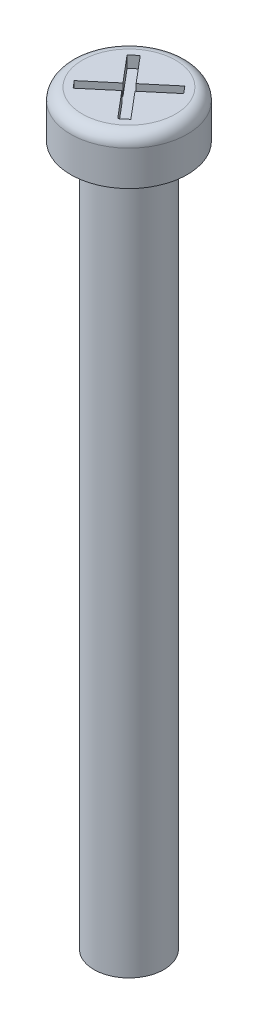
ISO-10303-21;
HEADER;
FILE_DESCRIPTION(('STEP AP214'),'2;1');
FILE_NAME('part.step','',(''),(''),'','','');
FILE_SCHEMA(('AUTOMOTIVE_DESIGN { 1 0 10303 214 1 1 1 1 }'));
ENDSEC;
DATA;
#1=APPLICATION_CONTEXT('core data for automotive mechanical design processes');
#2=APPLICATION_PROTOCOL_DEFINITION('international standard','automotive_design',2000,#1);
#3=PRODUCT_CONTEXT('',#1,'mechanical');
#4=PRODUCT('Part','Part','',(#3));
#5=PRODUCT_RELATED_PRODUCT_CATEGORY('part','',(#4));
#6=PRODUCT_DEFINITION_FORMATION('','',#4);
#7=PRODUCT_DEFINITION_CONTEXT('part definition',#1,'design');
#8=PRODUCT_DEFINITION('design','',#6,#7);
#9=PRODUCT_DEFINITION_SHAPE('','',#8);
#10=(LENGTH_UNIT() NAMED_UNIT(*) SI_UNIT(.MILLI.,.METRE.));
#11=(NAMED_UNIT(*) PLANE_ANGLE_UNIT() SI_UNIT($,.RADIAN.));
#12=(NAMED_UNIT(*) SI_UNIT($,.STERADIAN.) SOLID_ANGLE_UNIT());
#13=UNCERTAINTY_MEASURE_WITH_UNIT(LENGTH_MEASURE(1.E-05),#10,'distance_accuracy_value','');
#14=(GEOMETRIC_REPRESENTATION_CONTEXT(3) GLOBAL_UNCERTAINTY_ASSIGNED_CONTEXT((#13)) GLOBAL_UNIT_ASSIGNED_CONTEXT((#10,
#11,#12)) REPRESENTATION_CONTEXT('',''));
#15=CARTESIAN_POINT('',(0.,0.,0.));
#16=DIRECTION('',(0.,0.,1.));
#17=DIRECTION('',(1.,0.,0.));
#18=AXIS2_PLACEMENT_3D('',#15,#16,#17);
#19=CARTESIAN_POINT('',(0.,32.,0.));
#20=DIRECTION('',(0.,-1.,0.));
#21=DIRECTION('',(1.,0.,0.));
#22=AXIS2_PLACEMENT_3D('',#19,#20,#21);
#23=PLANE('',#22);
#24=DIRECTION('',(0.644699512907657,0.,0.764436091545022));
#25=VECTOR('',#24,1.);
#26=CARTESIAN_POINT('',(-1.23673160122054,32.,-1.15620107756156));
#27=LINE('',#26,#25);
#28=CARTESIAN_POINT('',(-1.23673160122054,32.,-1.15620107756156));
#29=VERTEX_POINT('',#28);
#30=CARTESIAN_POINT('',(-0.281827120890536,32.,-0.0239473157274735));
#31=VERTEX_POINT('',#30);
#32=EDGE_CURVE('E157',#29,#31,#27,.T.);
#33=ORIENTED_EDGE('',*,*,#32,.F.);
#34=DIRECTION('',(-0.764436091545022,0.,0.644699512907657));
#35=VECTOR('',#34,1.);
#36=CARTESIAN_POINT('',(-1.23673160122054,32.,-1.15620107756156));
#37=LINE('',#36,#35);
#38=CARTESIAN_POINT('',(-0.930957164602532,32.,-1.41408088272463));
#39=VERTEX_POINT('',#38);
#40=EDGE_CURVE('E47',#39,#29,#37,.T.);
#41=ORIENTED_EDGE('',*,*,#40,.F.);
#42=DIRECTION('',(-0.644699512907657,0.,-0.764436091545023));
#43=VECTOR('',#42,1.);
#44=CARTESIAN_POINT('',(-0.930957164602532,32.,-1.41408088272463));
#45=LINE('',#44,#43);
#46=CARTESIAN_POINT('',(0.023947315727473,32.,-0.281827120890536));
#47=VERTEX_POINT('',#46);
#48=EDGE_CURVE('E184',#47,#39,#45,.T.);
#49=ORIENTED_EDGE('',*,*,#48,.F.);
#50=DIRECTION('',(-0.764436091545023,0.,0.644699512907656));
#51=VECTOR('',#50,1.);
#52=CARTESIAN_POINT('',(0.023947315727473,32.,-0.281827120890536));
#53=LINE('',#52,#51);
#54=CARTESIAN_POINT('',(1.15620107756156,32.,-1.23673160122054));
#55=VERTEX_POINT('',#54);
#56=EDGE_CURVE('E182',#55,#47,#53,.T.);
#57=ORIENTED_EDGE('',*,*,#56,.F.);
#58=DIRECTION('',(-0.644699512907656,0.,-0.764436091545023));
#59=VECTOR('',#58,1.);
#60=CARTESIAN_POINT('',(1.41408088272463,32.,-0.930957164602532));
#61=LINE('',#60,#59);
#62=CARTESIAN_POINT('',(1.41408088272463,32.,-0.930957164602532));
#63=VERTEX_POINT('',#62);
#64=EDGE_CURVE('E131',#63,#55,#61,.T.);
#65=ORIENTED_EDGE('',*,*,#64,.F.);
#66=DIRECTION('',(0.764436091545023,0.,-0.644699512907656));
#67=VECTOR('',#66,1.);
#68=CARTESIAN_POINT('',(0.281827120890536,32.,0.0239473157274728));
#69=LINE('',#68,#67);
#70=CARTESIAN_POINT('',(0.281827120890536,32.,0.0239473157274728));
#71=VERTEX_POINT('',#70);
#72=EDGE_CURVE('E178',#71,#63,#69,.T.);
#73=ORIENTED_EDGE('',*,*,#72,.F.);
#74=DIRECTION('',(-0.644699512907657,0.,-0.764436091545023));
#75=VECTOR('',#74,1.);
#76=CARTESIAN_POINT('',(0.281827120890536,32.,0.0239473157274728));
#77=LINE('',#76,#75);
#78=CARTESIAN_POINT('',(1.23673160122054,32.,1.15620107756156));
#79=VERTEX_POINT('',#78);
#80=EDGE_CURVE('E175',#79,#71,#77,.T.);
#81=ORIENTED_EDGE('',*,*,#80,.F.);
#82=DIRECTION('',(0.764436091545022,0.,-0.644699512907657));
#83=VECTOR('',#82,1.);
#84=CARTESIAN_POINT('',(0.930957164602532,32.,1.41408088272463));
#85=LINE('',#84,#83);
#86=CARTESIAN_POINT('',(0.930957164602532,32.,1.41408088272463));
#87=VERTEX_POINT('',#86);
#88=EDGE_CURVE('E172',#87,#79,#85,.T.);
#89=ORIENTED_EDGE('',*,*,#88,.F.);
#90=DIRECTION('',(0.644699512907657,0.,0.764436091545023));
#91=VECTOR('',#90,1.);
#92=CARTESIAN_POINT('',(-0.0239473157274736,32.,0.281827120890536));
#93=LINE('',#92,#91);
#94=CARTESIAN_POINT('',(-0.0239473157274736,32.,0.281827120890536));
#95=VERTEX_POINT('',#94);
#96=EDGE_CURVE('E169',#95,#87,#93,.T.);
#97=ORIENTED_EDGE('',*,*,#96,.F.);
#98=DIRECTION('',(0.764436091545023,0.,-0.644699512907656));
#99=VECTOR('',#98,1.);
#100=CARTESIAN_POINT('',(-1.15620107756156,32.,1.23673160122054));
#101=LINE('',#100,#99);
#102=CARTESIAN_POINT('',(-1.15620107756156,32.,1.23673160122054));
#103=VERTEX_POINT('',#102);
#104=EDGE_CURVE('E166',#103,#95,#101,.T.);
#105=ORIENTED_EDGE('',*,*,#104,.F.);
#106=DIRECTION('',(0.644699512907656,0.,0.764436091545023));
#107=VECTOR('',#106,1.);
#108=CARTESIAN_POINT('',(-1.15620107756156,32.,1.23673160122054));
#109=LINE('',#108,#107);
#110=CARTESIAN_POINT('',(-1.41408088272463,32.,0.930957164602532));
#111=VERTEX_POINT('',#110);
#112=EDGE_CURVE('E163',#111,#103,#109,.T.);
#113=ORIENTED_EDGE('',*,*,#112,.F.);
#114=DIRECTION('',(-0.764436091545023,0.,0.644699512907656));
#115=VECTOR('',#114,1.);
#116=CARTESIAN_POINT('',(-1.41408088272463,32.,0.930957164602532));
#117=LINE('',#116,#115);
#118=EDGE_CURVE('E160',#31,#111,#117,.T.);
#119=ORIENTED_EDGE('',*,*,#118,.F.);
#120=EDGE_LOOP('',(#33,#41,#49,#57,#65,#73,#81,#89,#97,#105,#113,#119));
#121=FACE_BOUND('',#120,.T.);
#122=CARTESIAN_POINT('',(0.,32.,0.));
#123=DIRECTION('',(0.,1.,0.));
#124=DIRECTION('',(-1.,0.,0.));
#125=AXIS2_PLACEMENT_3D('',#122,#123,#124);
#126=CIRCLE('',#125,2.);
#127=CARTESIAN_POINT('',(-2.,32.,0.));
#128=VERTEX_POINT('',#127);
#129=EDGE_CURVE('E11',#128,#128,#126,.T.);
#130=ORIENTED_EDGE('',*,*,#129,.T.);
#131=EDGE_LOOP('',(#130));
#132=FACE_BOUND('',#131,.T.);
#133=ADVANCED_FACE('F33',(#121,#132),#23,.F.);
#134=CARTESIAN_POINT('',(0.,31.5,0.));
#135=DIRECTION('',(0.,1.,0.));
#136=DIRECTION('',(-1.,0.,0.));
#137=AXIS2_PLACEMENT_3D('',#134,#135,#136);
#138=TOROIDAL_SURFACE('',#137,2.,0.5);
#139=ORIENTED_EDGE('',*,*,#129,.F.);
#140=EDGE_LOOP('',(#139));
#141=FACE_BOUND('',#140,.T.);
#142=CARTESIAN_POINT('',(0.,31.5,0.));
#143=DIRECTION('',(0.,1.,0.));
#144=DIRECTION('',(-1.,0.,0.));
#145=AXIS2_PLACEMENT_3D('',#142,#143,#144);
#146=CIRCLE('',#145,2.5);
#147=CARTESIAN_POINT('',(-2.5,31.5,0.));
#148=VERTEX_POINT('',#147);
#149=EDGE_CURVE('E40',#148,#148,#146,.T.);
#150=ORIENTED_EDGE('',*,*,#149,.T.);
#151=EDGE_LOOP('',(#150));
#152=FACE_BOUND('',#151,.T.);
#153=ADVANCED_FACE('F216',(#141,#152),#138,.T.);
#154=CARTESIAN_POINT('',(0.,32.,0.));
#155=DIRECTION('',(0.,1.,0.));
#156=DIRECTION('',(-1.,0.,0.));
#157=AXIS2_PLACEMENT_3D('',#154,#155,#156);
#158=CYLINDRICAL_SURFACE('',#157,2.5);
#159=ORIENTED_EDGE('',*,*,#149,.F.);
#160=EDGE_LOOP('',(#159));
#161=FACE_BOUND('',#160,.T.);
#162=CARTESIAN_POINT('',(0.,30.,0.));
#163=DIRECTION('',(0.,1.,0.));
#164=DIRECTION('',(-1.,0.,0.));
#165=AXIS2_PLACEMENT_3D('',#162,#163,#164);
#166=CIRCLE('',#165,2.5);
#167=CARTESIAN_POINT('',(-2.5,30.,0.));
#168=VERTEX_POINT('',#167);
#169=EDGE_CURVE('E211',#168,#168,#166,.T.);
#170=ORIENTED_EDGE('',*,*,#169,.T.);
#171=EDGE_LOOP('',(#170));
#172=FACE_BOUND('',#171,.T.);
#173=ADVANCED_FACE('F218',(#161,#172),#158,.T.);
#174=CARTESIAN_POINT('',(2.5,30.,0.));
#175=DIRECTION('',(0.,1.,0.));
#176=DIRECTION('',(-1.,0.,0.));
#177=AXIS2_PLACEMENT_3D('',#174,#175,#176);
#178=PLANE('',#177);
#179=ORIENTED_EDGE('',*,*,#169,.F.);
#180=EDGE_LOOP('',(#179));
#181=FACE_BOUND('',#180,.T.);
#182=CARTESIAN_POINT('',(0.,30.,0.));
#183=DIRECTION('',(0.,1.,0.));
#184=DIRECTION('',(-1.,0.,0.));
#185=AXIS2_PLACEMENT_3D('',#182,#183,#184);
#186=CIRCLE('',#185,1.5);
#187=CARTESIAN_POINT('',(-1.5,30.,0.));
#188=VERTEX_POINT('',#187);
#189=EDGE_CURVE('E208',#188,#188,#186,.T.);
#190=ORIENTED_EDGE('',*,*,#189,.T.);
#191=EDGE_LOOP('',(#190));
#192=FACE_BOUND('',#191,.T.);
#193=ADVANCED_FACE('F221',(#181,#192),#178,.F.);
#194=CARTESIAN_POINT('',(0.,32.,0.));
#195=DIRECTION('',(0.,1.,0.));
#196=DIRECTION('',(-1.,0.,0.));
#197=AXIS2_PLACEMENT_3D('',#194,#195,#196);
#198=CYLINDRICAL_SURFACE('',#197,1.5);
#199=ORIENTED_EDGE('',*,*,#189,.F.);
#200=EDGE_LOOP('',(#199));
#201=FACE_BOUND('',#200,.T.);
#202=CARTESIAN_POINT('',(0.,0.,0.));
#203=DIRECTION('',(0.,1.,0.));
#204=DIRECTION('',(-1.,0.,0.));
#205=AXIS2_PLACEMENT_3D('',#202,#203,#204);
#206=CIRCLE('',#205,1.5);
#207=CARTESIAN_POINT('',(-1.5,0.,0.));
#208=VERTEX_POINT('',#207);
#209=EDGE_CURVE('E188',#208,#208,#206,.T.);
#210=ORIENTED_EDGE('',*,*,#209,.T.);
#211=EDGE_LOOP('',(#210));
#212=FACE_BOUND('',#211,.T.);
#213=ADVANCED_FACE('F227',(#201,#212),#198,.T.);
#214=CARTESIAN_POINT('',(1.5,0.,0.));
#215=DIRECTION('',(0.,1.,0.));
#216=DIRECTION('',(-1.,0.,0.));
#217=AXIS2_PLACEMENT_3D('',#214,#215,#216);
#218=PLANE('',#217);
#219=ORIENTED_EDGE('',*,*,#209,.F.);
#220=EDGE_LOOP('',(#219));
#221=FACE_BOUND('',#220,.T.);
#222=ADVANCED_FACE('F233',(#221),#218,.F.);
#223=CARTESIAN_POINT('',(-1.23673160122054,31.5,-1.15620107756156));
#224=DIRECTION('',(-0.644699512907657,0.,-0.764436091545022));
#225=DIRECTION('',(-0.764436091545022,0.,0.644699512907657));
#226=AXIS2_PLACEMENT_3D('',#223,#224,#225);
#227=PLANE('',#226);
#228=ORIENTED_EDGE('',*,*,#40,.T.);
#229=DIRECTION('',(0.,1.,0.));
#230=VECTOR('',#229,1.);
#231=CARTESIAN_POINT('',(-1.23673160122054,31.5,-1.15620107756156));
#232=LINE('',#231,#230);
#233=CARTESIAN_POINT('',(-1.23673160122054,31.5,-1.15620107756156));
#234=VERTEX_POINT('',#233);
#235=EDGE_CURVE('E95',#234,#29,#232,.T.);
#236=ORIENTED_EDGE('',*,*,#235,.F.);
#237=DIRECTION('',(-0.764436091545022,0.,0.644699512907657));
#238=VECTOR('',#237,1.);
#239=CARTESIAN_POINT('',(-1.23673160122054,31.5,-1.15620107756156));
#240=LINE('',#239,#238);
#241=CARTESIAN_POINT('',(-0.930957164602532,31.5,-1.41408088272463));
#242=VERTEX_POINT('',#241);
#243=EDGE_CURVE('E186',#242,#234,#240,.T.);
#244=ORIENTED_EDGE('',*,*,#243,.F.);
#245=DIRECTION('',(0.,1.,0.));
#246=VECTOR('',#245,1.);
#247=CARTESIAN_POINT('',(-0.930957164602532,31.5,-1.41408088272463));
#248=LINE('',#247,#246);
#249=EDGE_CURVE('E55',#242,#39,#248,.T.);
#250=ORIENTED_EDGE('',*,*,#249,.T.);
#251=EDGE_LOOP('',(#228,#236,#244,#250));
#252=FACE_BOUND('',#251,.T.);
#253=ADVANCED_FACE('F238',(#252),#227,.F.);
#254=CARTESIAN_POINT('',(-0.930957164602532,31.5,-1.41408088272463));
#255=DIRECTION('',(0.764436091545023,0.,-0.644699512907657));
#256=DIRECTION('',(-0.644699512907657,0.,-0.764436091545023));
#257=AXIS2_PLACEMENT_3D('',#254,#255,#256);
#258=PLANE('',#257);
#259=ORIENTED_EDGE('',*,*,#48,.T.);
#260=ORIENTED_EDGE('',*,*,#249,.F.);
#261=DIRECTION('',(-0.644699512907657,0.,-0.764436091545023));
#262=VECTOR('',#261,1.);
#263=CARTESIAN_POINT('',(-0.930957164602532,31.5,-1.41408088272463));
#264=LINE('',#263,#262);
#265=CARTESIAN_POINT('',(0.023947315727473,31.5,-0.281827120890536));
#266=VERTEX_POINT('',#265);
#267=EDGE_CURVE('E143',#266,#242,#264,.T.);
#268=ORIENTED_EDGE('',*,*,#267,.F.);
#269=DIRECTION('',(0.,1.,0.));
#270=VECTOR('',#269,1.);
#271=CARTESIAN_POINT('',(0.023947315727473,31.5,-0.281827120890536));
#272=LINE('',#271,#270);
#273=EDGE_CURVE('E135',#266,#47,#272,.T.);
#274=ORIENTED_EDGE('',*,*,#273,.T.);
#275=EDGE_LOOP('',(#259,#260,#268,#274));
#276=FACE_BOUND('',#275,.T.);
#277=ADVANCED_FACE('F243',(#276),#258,.F.);
#278=CARTESIAN_POINT('',(0.023947315727473,31.5,-0.281827120890536));
#279=DIRECTION('',(-0.644699512907656,0.,-0.764436091545023));
#280=DIRECTION('',(-0.764436091545023,0.,0.644699512907656));
#281=AXIS2_PLACEMENT_3D('',#278,#279,#280);
#282=PLANE('',#281);
#283=ORIENTED_EDGE('',*,*,#56,.T.);
#284=ORIENTED_EDGE('',*,*,#273,.F.);
#285=DIRECTION('',(-0.764436091545023,0.,0.644699512907656));
#286=VECTOR('',#285,1.);
#287=CARTESIAN_POINT('',(0.023947315727473,31.5,-0.281827120890536));
#288=LINE('',#287,#286);
#289=CARTESIAN_POINT('',(1.15620107756156,31.5,-1.23673160122054));
#290=VERTEX_POINT('',#289);
#291=EDGE_CURVE('E139',#290,#266,#288,.T.);
#292=ORIENTED_EDGE('',*,*,#291,.F.);
#293=DIRECTION('',(0.,1.,0.));
#294=VECTOR('',#293,1.);
#295=CARTESIAN_POINT('',(1.15620107756156,31.5,-1.23673160122054));
#296=LINE('',#295,#294);
#297=EDGE_CURVE('E124',#290,#55,#296,.T.);
#298=ORIENTED_EDGE('',*,*,#297,.T.);
#299=EDGE_LOOP('',(#283,#284,#292,#298));
#300=FACE_BOUND('',#299,.T.);
#301=ADVANCED_FACE('F140',(#300),#282,.F.);
#302=CARTESIAN_POINT('',(1.41408088272463,31.5,-0.930957164602532));
#303=DIRECTION('',(0.764436091545023,0.,-0.644699512907656));
#304=DIRECTION('',(-0.644699512907656,0.,-0.764436091545023));
#305=AXIS2_PLACEMENT_3D('',#302,#303,#304);
#306=PLANE('',#305);
#307=ORIENTED_EDGE('',*,*,#64,.T.);
#308=ORIENTED_EDGE('',*,*,#297,.F.);
#309=DIRECTION('',(-0.644699512907656,0.,-0.764436091545023));
#310=VECTOR('',#309,1.);
#311=CARTESIAN_POINT('',(1.41408088272463,31.5,-0.930957164602532));
#312=LINE('',#311,#310);
#313=CARTESIAN_POINT('',(1.41408088272463,31.5,-0.930957164602532));
#314=VERTEX_POINT('',#313);
#315=EDGE_CURVE('E128',#314,#290,#312,.T.);
#316=ORIENTED_EDGE('',*,*,#315,.F.);
#317=DIRECTION('',(0.,1.,0.));
#318=VECTOR('',#317,1.);
#319=CARTESIAN_POINT('',(1.41408088272463,31.5,-0.930957164602532));
#320=LINE('',#319,#318);
#321=EDGE_CURVE('E136',#314,#63,#320,.T.);
#322=ORIENTED_EDGE('',*,*,#321,.T.);
#323=EDGE_LOOP('',(#307,#308,#316,#322));
#324=FACE_BOUND('',#323,.T.);
#325=ADVANCED_FACE('F126',(#324),#306,.F.);
#326=CARTESIAN_POINT('',(0.281827120890536,31.5,0.0239473157274728));
#327=DIRECTION('',(0.644699512907657,0.,0.764436091545023));
#328=DIRECTION('',(0.764436091545023,0.,-0.644699512907657));
#329=AXIS2_PLACEMENT_3D('',#326,#327,#328);
#330=PLANE('',#329);
#331=ORIENTED_EDGE('',*,*,#72,.T.);
#332=ORIENTED_EDGE('',*,*,#321,.F.);
#333=DIRECTION('',(0.764436091545023,0.,-0.644699512907656));
#334=VECTOR('',#333,1.);
#335=CARTESIAN_POINT('',(0.281827120890536,31.5,0.0239473157274728));
#336=LINE('',#335,#334);
#337=CARTESIAN_POINT('',(0.281827120890536,31.5,0.0239473157274728));
#338=VERTEX_POINT('',#337);
#339=EDGE_CURVE('E149',#338,#314,#336,.T.);
#340=ORIENTED_EDGE('',*,*,#339,.F.);
#341=DIRECTION('',(0.,1.,0.));
#342=VECTOR('',#341,1.);
#343=CARTESIAN_POINT('',(0.281827120890536,31.5,0.0239473157274728));
#344=LINE('',#343,#342);
#345=EDGE_CURVE('E191',#338,#71,#344,.T.);
#346=ORIENTED_EDGE('',*,*,#345,.T.);
#347=EDGE_LOOP('',(#331,#332,#340,#346));
#348=FACE_BOUND('',#347,.T.);
#349=ADVANCED_FACE('F286',(#348),#330,.F.);
#350=CARTESIAN_POINT('',(0.281827120890536,31.5,0.0239473157274728));
#351=DIRECTION('',(0.764436091545023,0.,-0.644699512907657));
#352=DIRECTION('',(-0.644699512907657,0.,-0.764436091545023));
#353=AXIS2_PLACEMENT_3D('',#350,#351,#352);
#354=PLANE('',#353);
#355=ORIENTED_EDGE('',*,*,#80,.T.);
#356=ORIENTED_EDGE('',*,*,#345,.F.);
#357=DIRECTION('',(-0.644699512907657,0.,-0.764436091545023));
#358=VECTOR('',#357,1.);
#359=CARTESIAN_POINT('',(0.281827120890536,31.5,0.0239473157274728));
#360=LINE('',#359,#358);
#361=CARTESIAN_POINT('',(1.23673160122054,31.5,1.15620107756156));
#362=VERTEX_POINT('',#361);
#363=EDGE_CURVE('E151',#362,#338,#360,.T.);
#364=ORIENTED_EDGE('',*,*,#363,.F.);
#365=DIRECTION('',(0.,1.,0.));
#366=VECTOR('',#365,1.);
#367=CARTESIAN_POINT('',(1.23673160122054,31.5,1.15620107756156));
#368=LINE('',#367,#366);
#369=EDGE_CURVE('E193',#362,#79,#368,.T.);
#370=ORIENTED_EDGE('',*,*,#369,.T.);
#371=EDGE_LOOP('',(#355,#356,#364,#370));
#372=FACE_BOUND('',#371,.T.);
#373=ADVANCED_FACE('F282',(#372),#354,.F.);
#374=CARTESIAN_POINT('',(0.930957164602532,31.5,1.41408088272463));
#375=DIRECTION('',(0.644699512907657,0.,0.764436091545022));
#376=DIRECTION('',(0.764436091545022,0.,-0.644699512907657));
#377=AXIS2_PLACEMENT_3D('',#374,#375,#376);
#378=PLANE('',#377);
#379=ORIENTED_EDGE('',*,*,#88,.T.);
#380=ORIENTED_EDGE('',*,*,#369,.F.);
#381=DIRECTION('',(0.764436091545022,0.,-0.644699512907657));
#382=VECTOR('',#381,1.);
#383=CARTESIAN_POINT('',(0.930957164602532,31.5,1.41408088272463));
#384=LINE('',#383,#382);
#385=CARTESIAN_POINT('',(0.930957164602532,31.5,1.41408088272463));
#386=VERTEX_POINT('',#385);
#387=EDGE_CURVE('E277',#386,#362,#384,.T.);
#388=ORIENTED_EDGE('',*,*,#387,.F.);
#389=DIRECTION('',(0.,1.,0.));
#390=VECTOR('',#389,1.);
#391=CARTESIAN_POINT('',(0.930957164602532,31.5,1.41408088272463));
#392=LINE('',#391,#390);
#393=EDGE_CURVE('E195',#386,#87,#392,.T.);
#394=ORIENTED_EDGE('',*,*,#393,.T.);
#395=EDGE_LOOP('',(#379,#380,#388,#394));
#396=FACE_BOUND('',#395,.T.);
#397=ADVANCED_FACE('F301',(#396),#378,.F.);
#398=CARTESIAN_POINT('',(-0.0239473157274736,31.5,0.281827120890536));
#399=DIRECTION('',(-0.764436091545023,0.,0.644699512907657));
#400=DIRECTION('',(0.644699512907657,0.,0.764436091545023));
#401=AXIS2_PLACEMENT_3D('',#398,#399,#400);
#402=PLANE('',#401);
#403=ORIENTED_EDGE('',*,*,#96,.T.);
#404=ORIENTED_EDGE('',*,*,#393,.F.);
#405=DIRECTION('',(0.644699512907657,0.,0.764436091545023));
#406=VECTOR('',#405,1.);
#407=CARTESIAN_POINT('',(-0.0239473157274736,31.5,0.281827120890536));
#408=LINE('',#407,#406);
#409=CARTESIAN_POINT('',(-0.0239473157274736,31.5,0.281827120890536));
#410=VERTEX_POINT('',#409);
#411=EDGE_CURVE('E274',#410,#386,#408,.T.);
#412=ORIENTED_EDGE('',*,*,#411,.F.);
#413=DIRECTION('',(0.,1.,0.));
#414=VECTOR('',#413,1.);
#415=CARTESIAN_POINT('',(-0.0239473157274736,31.5,0.281827120890536));
#416=LINE('',#415,#414);
#417=EDGE_CURVE('E197',#410,#95,#416,.T.);
#418=ORIENTED_EDGE('',*,*,#417,.T.);
#419=EDGE_LOOP('',(#403,#404,#412,#418));
#420=FACE_BOUND('',#419,.T.);
#421=ADVANCED_FACE('F304',(#420),#402,.F.);
#422=CARTESIAN_POINT('',(-1.15620107756156,31.5,1.23673160122054));
#423=DIRECTION('',(0.644699512907656,0.,0.764436091545023));
#424=DIRECTION('',(0.764436091545023,0.,-0.644699512907656));
#425=AXIS2_PLACEMENT_3D('',#422,#423,#424);
#426=PLANE('',#425);
#427=ORIENTED_EDGE('',*,*,#104,.T.);
#428=ORIENTED_EDGE('',*,*,#417,.F.);
#429=DIRECTION('',(0.764436091545023,0.,-0.644699512907656));
#430=VECTOR('',#429,1.);
#431=CARTESIAN_POINT('',(-1.15620107756156,31.5,1.23673160122054));
#432=LINE('',#431,#430);
#433=CARTESIAN_POINT('',(-1.15620107756156,31.5,1.23673160122054));
#434=VERTEX_POINT('',#433);
#435=EDGE_CURVE('E271',#434,#410,#432,.T.);
#436=ORIENTED_EDGE('',*,*,#435,.F.);
#437=DIRECTION('',(0.,1.,0.));
#438=VECTOR('',#437,1.);
#439=CARTESIAN_POINT('',(-1.15620107756156,31.5,1.23673160122054));
#440=LINE('',#439,#438);
#441=EDGE_CURVE('E199',#434,#103,#440,.T.);
#442=ORIENTED_EDGE('',*,*,#441,.T.);
#443=EDGE_LOOP('',(#427,#428,#436,#442));
#444=FACE_BOUND('',#443,.T.);
#445=ADVANCED_FACE('F308',(#444),#426,.F.);
#446=CARTESIAN_POINT('',(-1.15620107756156,31.5,1.23673160122054));
#447=DIRECTION('',(-0.764436091545023,0.,0.644699512907656));
#448=DIRECTION('',(0.644699512907656,0.,0.764436091545023));
#449=AXIS2_PLACEMENT_3D('',#446,#447,#448);
#450=PLANE('',#449);
#451=ORIENTED_EDGE('',*,*,#112,.T.);
#452=ORIENTED_EDGE('',*,*,#441,.F.);
#453=DIRECTION('',(0.644699512907656,0.,0.764436091545023));
#454=VECTOR('',#453,1.);
#455=CARTESIAN_POINT('',(-1.15620107756156,31.5,1.23673160122054));
#456=LINE('',#455,#454);
#457=CARTESIAN_POINT('',(-1.41408088272463,31.5,0.930957164602532));
#458=VERTEX_POINT('',#457);
#459=EDGE_CURVE('E268',#458,#434,#456,.T.);
#460=ORIENTED_EDGE('',*,*,#459,.F.);
#461=DIRECTION('',(0.,1.,0.));
#462=VECTOR('',#461,1.);
#463=CARTESIAN_POINT('',(-1.41408088272463,31.5,0.930957164602532));
#464=LINE('',#463,#462);
#465=EDGE_CURVE('E201',#458,#111,#464,.T.);
#466=ORIENTED_EDGE('',*,*,#465,.T.);
#467=EDGE_LOOP('',(#451,#452,#460,#466));
#468=FACE_BOUND('',#467,.T.);
#469=ADVANCED_FACE('F312',(#468),#450,.F.);
#470=CARTESIAN_POINT('',(-1.41408088272463,31.5,0.930957164602532));
#471=DIRECTION('',(-0.644699512907656,0.,-0.764436091545023));
#472=DIRECTION('',(-0.764436091545023,0.,0.644699512907656));
#473=AXIS2_PLACEMENT_3D('',#470,#471,#472);
#474=PLANE('',#473);
#475=ORIENTED_EDGE('',*,*,#118,.T.);
#476=ORIENTED_EDGE('',*,*,#465,.F.);
#477=DIRECTION('',(-0.764436091545023,0.,0.644699512907656));
#478=VECTOR('',#477,1.);
#479=CARTESIAN_POINT('',(-1.41408088272463,31.5,0.930957164602532));
#480=LINE('',#479,#478);
#481=CARTESIAN_POINT('',(-0.281827120890536,31.5,-0.0239473157274735));
#482=VERTEX_POINT('',#481);
#483=EDGE_CURVE('E263',#482,#458,#480,.T.);
#484=ORIENTED_EDGE('',*,*,#483,.F.);
#485=DIRECTION('',(0.,1.,0.));
#486=VECTOR('',#485,1.);
#487=CARTESIAN_POINT('',(-0.281827120890536,31.5,-0.0239473157274735));
#488=LINE('',#487,#486);
#489=EDGE_CURVE('E203',#482,#31,#488,.T.);
#490=ORIENTED_EDGE('',*,*,#489,.T.);
#491=EDGE_LOOP('',(#475,#476,#484,#490));
#492=FACE_BOUND('',#491,.T.);
#493=ADVANCED_FACE('F316',(#492),#474,.F.);
#494=CARTESIAN_POINT('',(-1.23673160122054,31.5,-1.15620107756156));
#495=DIRECTION('',(-0.764436091545023,0.,0.644699512907657));
#496=DIRECTION('',(0.644699512907657,0.,0.764436091545023));
#497=AXIS2_PLACEMENT_3D('',#494,#495,#496);
#498=PLANE('',#497);
#499=ORIENTED_EDGE('',*,*,#32,.T.);
#500=ORIENTED_EDGE('',*,*,#489,.F.);
#501=DIRECTION('',(0.644699512907657,0.,0.764436091545022));
#502=VECTOR('',#501,1.);
#503=CARTESIAN_POINT('',(-1.23673160122054,31.5,-1.15620107756156));
#504=LINE('',#503,#502);
#505=EDGE_CURVE('E261',#234,#482,#504,.T.);
#506=ORIENTED_EDGE('',*,*,#505,.F.);
#507=ORIENTED_EDGE('',*,*,#235,.T.);
#508=EDGE_LOOP('',(#499,#500,#506,#507));
#509=FACE_BOUND('',#508,.T.);
#510=ADVANCED_FACE('F258',(#509),#498,.F.);
#511=CARTESIAN_POINT('',(0.,31.5,0.));
#512=DIRECTION('',(0.,-1.,0.));
#513=DIRECTION('',(0.,0.,-1.));
#514=AXIS2_PLACEMENT_3D('',#511,#512,#513);
#515=PLANE('',#514);
#516=ORIENTED_EDGE('',*,*,#243,.T.);
#517=ORIENTED_EDGE('',*,*,#505,.T.);
#518=ORIENTED_EDGE('',*,*,#483,.T.);
#519=ORIENTED_EDGE('',*,*,#459,.T.);
#520=ORIENTED_EDGE('',*,*,#435,.T.);
#521=ORIENTED_EDGE('',*,*,#411,.T.);
#522=ORIENTED_EDGE('',*,*,#387,.T.);
#523=ORIENTED_EDGE('',*,*,#363,.T.);
#524=ORIENTED_EDGE('',*,*,#339,.T.);
#525=ORIENTED_EDGE('',*,*,#315,.T.);
#526=ORIENTED_EDGE('',*,*,#291,.T.);
#527=ORIENTED_EDGE('',*,*,#267,.T.);
#528=EDGE_LOOP('',(#516,#517,#518,#519,#520,#521,#522,#523,#524,#525,#526,#527));
#529=FACE_BOUND('',#528,.T.);
#530=ADVANCED_FACE('F146',(#529),#515,.F.);
#531=CLOSED_SHELL('',(#133,#153,#173,#193,#213,#222,#253,#277,#301,#325,#349,#373,#397,#421,
#445,#469,#493,#510,#530));
#532=MANIFOLD_SOLID_BREP('B2',#531);
#533=ADVANCED_BREP_SHAPE_REPRESENTATION('',(#18,#532),#14);
#534=SHAPE_DEFINITION_REPRESENTATION(#9,#533);
ENDSEC;
END-ISO-10303-21;
